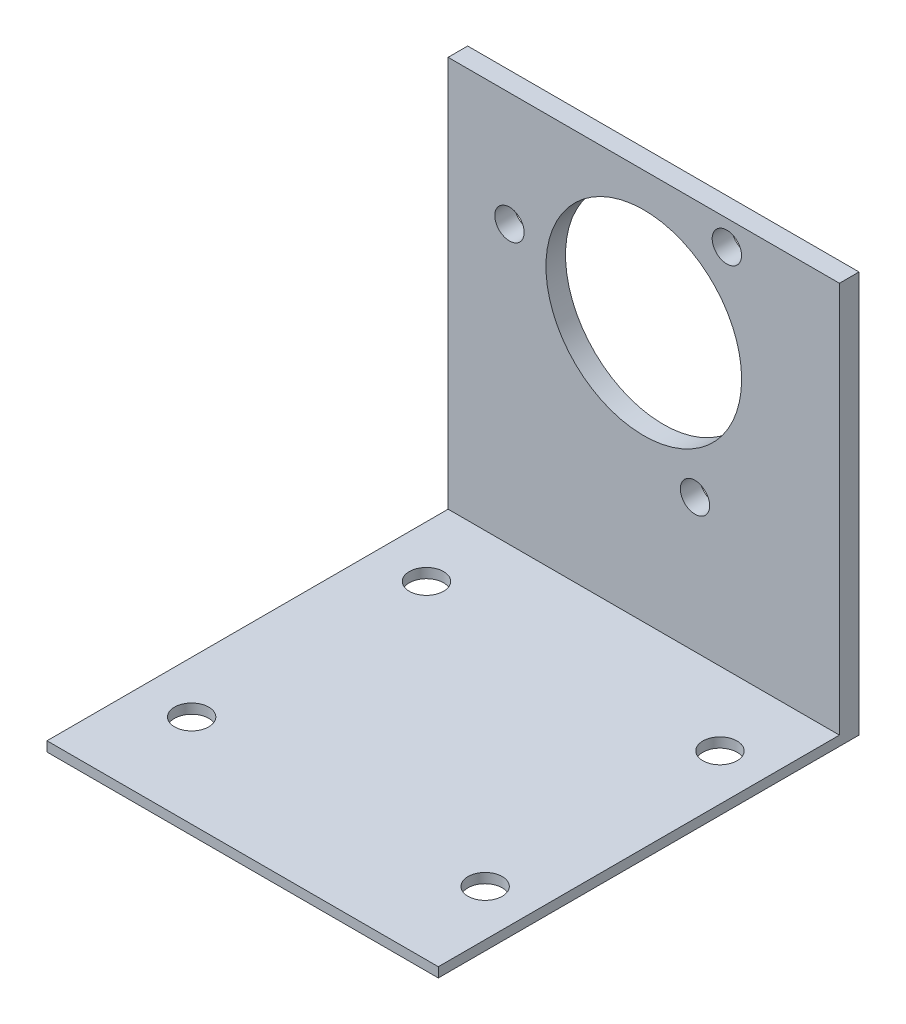
ISO-10303-21;
HEADER;
FILE_DESCRIPTION(('STEP AP214'),'2;1');
FILE_NAME('part.step','',(''),(''),'','','');
FILE_SCHEMA(('AUTOMOTIVE_DESIGN { 1 0 10303 214 1 1 1 1 }'));
ENDSEC;
DATA;
#1=APPLICATION_CONTEXT('core data for automotive mechanical design processes');
#2=APPLICATION_PROTOCOL_DEFINITION('international standard','automotive_design',2000,#1);
#3=PRODUCT_CONTEXT('',#1,'mechanical');
#4=PRODUCT('Part','Part','',(#3));
#5=PRODUCT_RELATED_PRODUCT_CATEGORY('part','',(#4));
#6=PRODUCT_DEFINITION_FORMATION('','',#4);
#7=PRODUCT_DEFINITION_CONTEXT('part definition',#1,'design');
#8=PRODUCT_DEFINITION('design','',#6,#7);
#9=PRODUCT_DEFINITION_SHAPE('','',#8);
#10=(LENGTH_UNIT() NAMED_UNIT(*) SI_UNIT(.MILLI.,.METRE.));
#11=(NAMED_UNIT(*) PLANE_ANGLE_UNIT() SI_UNIT($,.RADIAN.));
#12=(NAMED_UNIT(*) SI_UNIT($,.STERADIAN.) SOLID_ANGLE_UNIT());
#13=UNCERTAINTY_MEASURE_WITH_UNIT(LENGTH_MEASURE(1.E-05),#10,'distance_accuracy_value','');
#14=(GEOMETRIC_REPRESENTATION_CONTEXT(3) GLOBAL_UNCERTAINTY_ASSIGNED_CONTEXT((#13)) GLOBAL_UNIT_ASSIGNED_CONTEXT((#10,
#11,#12)) REPRESENTATION_CONTEXT('',''));
#15=CARTESIAN_POINT('',(0.,0.,0.));
#16=DIRECTION('',(0.,0.,1.));
#17=DIRECTION('',(1.,0.,0.));
#18=AXIS2_PLACEMENT_3D('',#15,#16,#17);
#19=CARTESIAN_POINT('',(0.,-1.,21.5));
#20=DIRECTION('',(0.,0.,1.));
#21=DIRECTION('',(1.,0.,0.));
#22=AXIS2_PLACEMENT_3D('',#19,#20,#21);
#23=PLANE('',#22);
#24=DIRECTION('',(1.,0.,0.));
#25=VECTOR('',#24,1.);
#26=CARTESIAN_POINT('',(0.,0.,21.5));
#27=LINE('',#26,#25);
#28=CARTESIAN_POINT('',(-20.,0.,21.5));
#29=VERTEX_POINT('',#28);
#30=CARTESIAN_POINT('',(20.,0.,21.5));
#31=VERTEX_POINT('',#30);
#32=EDGE_CURVE('E168',#29,#31,#27,.T.);
#33=ORIENTED_EDGE('',*,*,#32,.F.);
#34=DIRECTION('',(0.,1.,0.));
#35=VECTOR('',#34,1.);
#36=CARTESIAN_POINT('',(-20.,-1.,21.5));
#37=LINE('',#36,#35);
#38=CARTESIAN_POINT('',(-20.,-1.,21.5));
#39=VERTEX_POINT('',#38);
#40=EDGE_CURVE('E12',#39,#29,#37,.T.);
#41=ORIENTED_EDGE('',*,*,#40,.F.);
#42=DIRECTION('',(1.,0.,0.));
#43=VECTOR('',#42,1.);
#44=CARTESIAN_POINT('',(0.,-1.,21.5));
#45=LINE('',#44,#43);
#46=CARTESIAN_POINT('',(20.,-1.,21.5));
#47=VERTEX_POINT('',#46);
#48=EDGE_CURVE('E151',#39,#47,#45,.T.);
#49=ORIENTED_EDGE('',*,*,#48,.T.);
#50=DIRECTION('',(0.,1.,0.));
#51=VECTOR('',#50,1.);
#52=CARTESIAN_POINT('',(20.,-1.,21.5));
#53=LINE('',#52,#51);
#54=EDGE_CURVE('E53',#47,#31,#53,.T.);
#55=ORIENTED_EDGE('',*,*,#54,.T.);
#56=EDGE_LOOP('',(#33,#41,#49,#55));
#57=FACE_BOUND('',#56,.T.);
#58=ADVANCED_FACE('F49',(#57),#23,.T.);
#59=CARTESIAN_POINT('',(-20.,-1.,0.));
#60=DIRECTION('',(1.,0.,0.));
#61=DIRECTION('',(0.,0.,-1.));
#62=AXIS2_PLACEMENT_3D('',#59,#60,#61);
#63=PLANE('',#62);
#64=DIRECTION('',(0.,0.,-1.));
#65=VECTOR('',#64,1.);
#66=CARTESIAN_POINT('',(-20.,0.,0.));
#67=LINE('',#66,#65);
#68=CARTESIAN_POINT('',(-20.,0.,-19.5));
#69=VERTEX_POINT('',#68);
#70=EDGE_CURVE('E130',#29,#69,#67,.T.);
#71=ORIENTED_EDGE('',*,*,#70,.T.);
#72=DIRECTION('',(0.,-1.,0.));
#73=VECTOR('',#72,1.);
#74=CARTESIAN_POINT('',(-20.,40.,-19.5));
#75=LINE('',#74,#73);
#76=CARTESIAN_POINT('',(-20.,40.,-19.5));
#77=VERTEX_POINT('',#76);
#78=EDGE_CURVE('E113',#77,#69,#75,.T.);
#79=ORIENTED_EDGE('',*,*,#78,.F.);
#80=DIRECTION('',(0.,0.,1.));
#81=VECTOR('',#80,1.);
#82=CARTESIAN_POINT('',(-20.,40.,0.));
#83=LINE('',#82,#81);
#84=CARTESIAN_POINT('',(-20.,40.,-21.5));
#85=VERTEX_POINT('',#84);
#86=EDGE_CURVE('E120',#85,#77,#83,.T.);
#87=ORIENTED_EDGE('',*,*,#86,.F.);
#88=DIRECTION('',(0.,1.,0.));
#89=VECTOR('',#88,1.);
#90=CARTESIAN_POINT('',(-20.,-1.,-21.5));
#91=LINE('',#90,#89);
#92=CARTESIAN_POINT('',(-20.,-1.,-21.5));
#93=VERTEX_POINT('',#92);
#94=EDGE_CURVE('E58',#93,#85,#91,.T.);
#95=ORIENTED_EDGE('',*,*,#94,.F.);
#96=DIRECTION('',(0.,0.,-1.));
#97=VECTOR('',#96,1.);
#98=CARTESIAN_POINT('',(-20.,-1.,0.));
#99=LINE('',#98,#97);
#100=EDGE_CURVE('E157',#39,#93,#99,.T.);
#101=ORIENTED_EDGE('',*,*,#100,.F.);
#102=ORIENTED_EDGE('',*,*,#40,.T.);
#103=EDGE_LOOP('',(#71,#79,#87,#95,#101,#102));
#104=FACE_BOUND('',#103,.T.);
#105=ADVANCED_FACE('F129',(#104),#63,.F.);
#106=CARTESIAN_POINT('',(0.,-1.,-21.5));
#107=DIRECTION('',(0.,0.,1.));
#108=DIRECTION('',(1.,0.,0.));
#109=AXIS2_PLACEMENT_3D('',#106,#107,#108);
#110=PLANE('',#109);
#111=CARTESIAN_POINT('',(5.23636965743753,13.671109447397,-21.5));
#112=DIRECTION('',(0.,0.,1.));
#113=DIRECTION('',(1.,0.,0.));
#114=AXIS2_PLACEMENT_3D('',#111,#112,#113);
#115=CIRCLE('',#114,1.5);
#116=CARTESIAN_POINT('',(6.73636965743753,13.671109447397,-21.5));
#117=VERTEX_POINT('',#116);
#118=EDGE_CURVE('E253',#117,#117,#115,.T.);
#119=ORIENTED_EDGE('',*,*,#118,.T.);
#120=EDGE_LOOP('',(#119));
#121=FACE_BOUND('',#120,.T.);
#122=CARTESIAN_POINT('',(8.49196029220565,37.4492744232484,-21.5));
#123=DIRECTION('',(0.,0.,1.));
#124=DIRECTION('',(1.,0.,0.));
#125=AXIS2_PLACEMENT_3D('',#122,#123,#124);
#126=CIRCLE('',#125,1.5);
#127=CARTESIAN_POINT('',(9.99196029220565,37.4492744232484,-21.5));
#128=VERTEX_POINT('',#127);
#129=EDGE_CURVE('E249',#128,#128,#126,.T.);
#130=ORIENTED_EDGE('',*,*,#129,.T.);
#131=EDGE_LOOP('',(#130));
#132=FACE_BOUND('',#131,.T.);
#133=CARTESIAN_POINT('',(-13.7283299496432,28.3796161293546,-21.5));
#134=DIRECTION('',(0.,0.,1.));
#135=DIRECTION('',(1.,0.,0.));
#136=AXIS2_PLACEMENT_3D('',#133,#134,#135);
#137=CIRCLE('',#136,1.5);
#138=CARTESIAN_POINT('',(-12.2283299496432,28.3796161293546,-21.5));
#139=VERTEX_POINT('',#138);
#140=EDGE_CURVE('E247',#139,#139,#137,.T.);
#141=ORIENTED_EDGE('',*,*,#140,.T.);
#142=EDGE_LOOP('',(#141));
#143=FACE_BOUND('',#142,.T.);
#144=CARTESIAN_POINT('',(0.,26.5,-21.5));
#145=DIRECTION('',(0.,0.,1.));
#146=DIRECTION('',(1.,0.,0.));
#147=AXIS2_PLACEMENT_3D('',#144,#145,#146);
#148=CIRCLE('',#147,10.);
#149=CARTESIAN_POINT('',(10.,26.5,-21.5));
#150=VERTEX_POINT('',#149);
#151=EDGE_CURVE('E250',#150,#150,#148,.T.);
#152=ORIENTED_EDGE('',*,*,#151,.T.);
#153=EDGE_LOOP('',(#152));
#154=FACE_BOUND('',#153,.T.);
#155=ORIENTED_EDGE('',*,*,#94,.T.);
#156=DIRECTION('',(-1.,0.,0.));
#157=VECTOR('',#156,1.);
#158=CARTESIAN_POINT('',(0.,40.,-21.5));
#159=LINE('',#158,#157);
#160=CARTESIAN_POINT('',(20.,40.,-21.5));
#161=VERTEX_POINT('',#160);
#162=EDGE_CURVE('E126',#161,#85,#159,.T.);
#163=ORIENTED_EDGE('',*,*,#162,.F.);
#164=DIRECTION('',(0.,1.,0.));
#165=VECTOR('',#164,1.);
#166=CARTESIAN_POINT('',(20.,-1.,-21.5));
#167=LINE('',#166,#165);
#168=CARTESIAN_POINT('',(20.,-1.,-21.5));
#169=VERTEX_POINT('',#168);
#170=EDGE_CURVE('E174',#169,#161,#167,.T.);
#171=ORIENTED_EDGE('',*,*,#170,.F.);
#172=DIRECTION('',(1.,0.,0.));
#173=VECTOR('',#172,1.);
#174=CARTESIAN_POINT('',(0.,-1.,-21.5));
#175=LINE('',#174,#173);
#176=EDGE_CURVE('E155',#93,#169,#175,.T.);
#177=ORIENTED_EDGE('',*,*,#176,.F.);
#178=EDGE_LOOP('',(#155,#163,#171,#177));
#179=FACE_BOUND('',#178,.T.);
#180=ADVANCED_FACE('F194',(#121,#132,#143,#154,#179),#110,.F.);
#181=CARTESIAN_POINT('',(-14.7150530034863,-1.,-12.));
#182=DIRECTION('',(0.,1.,0.));
#183=DIRECTION('',(0.,0.,1.));
#184=AXIS2_PLACEMENT_3D('',#181,#182,#183);
#185=CYLINDRICAL_SURFACE('',#184,1.75);
#186=CARTESIAN_POINT('',(-14.7150530034863,-1.,-12.));
#187=DIRECTION('',(0.,1.,0.));
#188=DIRECTION('',(0.,0.,1.));
#189=AXIS2_PLACEMENT_3D('',#186,#187,#188);
#190=CIRCLE('',#189,1.75);
#191=CARTESIAN_POINT('',(-14.7150530034863,-1.,-10.25));
#192=VERTEX_POINT('',#191);
#193=EDGE_CURVE('E148',#192,#192,#190,.T.);
#194=ORIENTED_EDGE('',*,*,#193,.F.);
#195=EDGE_LOOP('',(#194));
#196=FACE_BOUND('',#195,.T.);
#197=CARTESIAN_POINT('',(-14.7150530034863,0.,-12.));
#198=DIRECTION('',(0.,1.,0.));
#199=DIRECTION('',(0.,0.,1.));
#200=AXIS2_PLACEMENT_3D('',#197,#198,#199);
#201=CIRCLE('',#200,1.75);
#202=CARTESIAN_POINT('',(-14.7150530034863,0.,-10.25));
#203=VERTEX_POINT('',#202);
#204=EDGE_CURVE('E165',#203,#203,#201,.T.);
#205=ORIENTED_EDGE('',*,*,#204,.T.);
#206=EDGE_LOOP('',(#205));
#207=FACE_BOUND('',#206,.T.);
#208=ADVANCED_FACE('F191',(#196,#207),#185,.F.);
#209=CARTESIAN_POINT('',(15.2849469965137,-1.,-12.));
#210=DIRECTION('',(0.,1.,0.));
#211=DIRECTION('',(0.,0.,1.));
#212=AXIS2_PLACEMENT_3D('',#209,#210,#211);
#213=CYLINDRICAL_SURFACE('',#212,1.75);
#214=CARTESIAN_POINT('',(15.2849469965137,-1.,-12.));
#215=DIRECTION('',(0.,1.,0.));
#216=DIRECTION('',(0.,0.,1.));
#217=AXIS2_PLACEMENT_3D('',#214,#215,#216);
#218=CIRCLE('',#217,1.75);
#219=CARTESIAN_POINT('',(15.2849469965137,-1.,-10.25));
#220=VERTEX_POINT('',#219);
#221=EDGE_CURVE('E145',#220,#220,#218,.T.);
#222=ORIENTED_EDGE('',*,*,#221,.F.);
#223=EDGE_LOOP('',(#222));
#224=FACE_BOUND('',#223,.T.);
#225=CARTESIAN_POINT('',(15.2849469965137,0.,-12.));
#226=DIRECTION('',(0.,1.,0.));
#227=DIRECTION('',(0.,0.,1.));
#228=AXIS2_PLACEMENT_3D('',#225,#226,#227);
#229=CIRCLE('',#228,1.75);
#230=CARTESIAN_POINT('',(15.2849469965137,0.,-10.25));
#231=VERTEX_POINT('',#230);
#232=EDGE_CURVE('E162',#231,#231,#229,.T.);
#233=ORIENTED_EDGE('',*,*,#232,.T.);
#234=EDGE_LOOP('',(#233));
#235=FACE_BOUND('',#234,.T.);
#236=ADVANCED_FACE('F193',(#224,#235),#213,.F.);
#237=CARTESIAN_POINT('',(-14.7150530034863,-1.,12.));
#238=DIRECTION('',(0.,1.,0.));
#239=DIRECTION('',(0.,0.,1.));
#240=AXIS2_PLACEMENT_3D('',#237,#238,#239);
#241=CYLINDRICAL_SURFACE('',#240,1.75);
#242=CARTESIAN_POINT('',(-14.7150530034863,-1.,12.));
#243=DIRECTION('',(0.,1.,0.));
#244=DIRECTION('',(0.,0.,1.));
#245=AXIS2_PLACEMENT_3D('',#242,#243,#244);
#246=CIRCLE('',#245,1.75);
#247=CARTESIAN_POINT('',(-14.7150530034863,-1.,13.75));
#248=VERTEX_POINT('',#247);
#249=EDGE_CURVE('E142',#248,#248,#246,.T.);
#250=ORIENTED_EDGE('',*,*,#249,.F.);
#251=EDGE_LOOP('',(#250));
#252=FACE_BOUND('',#251,.T.);
#253=CARTESIAN_POINT('',(-14.7150530034863,0.,12.));
#254=DIRECTION('',(0.,1.,0.));
#255=DIRECTION('',(0.,0.,1.));
#256=AXIS2_PLACEMENT_3D('',#253,#254,#255);
#257=CIRCLE('',#256,1.75);
#258=CARTESIAN_POINT('',(-14.7150530034863,0.,13.75));
#259=VERTEX_POINT('',#258);
#260=EDGE_CURVE('E134',#259,#259,#257,.T.);
#261=ORIENTED_EDGE('',*,*,#260,.T.);
#262=EDGE_LOOP('',(#261));
#263=FACE_BOUND('',#262,.T.);
#264=ADVANCED_FACE('F201',(#252,#263),#241,.F.);
#265=CARTESIAN_POINT('',(15.2849469965137,-1.,12.));
#266=DIRECTION('',(0.,1.,0.));
#267=DIRECTION('',(0.,0.,1.));
#268=AXIS2_PLACEMENT_3D('',#265,#266,#267);
#269=CYLINDRICAL_SURFACE('',#268,1.75);
#270=CARTESIAN_POINT('',(15.2849469965137,-1.,12.));
#271=DIRECTION('',(0.,1.,0.));
#272=DIRECTION('',(0.,0.,1.));
#273=AXIS2_PLACEMENT_3D('',#270,#271,#272);
#274=CIRCLE('',#273,1.75);
#275=CARTESIAN_POINT('',(15.2849469965137,-1.,13.75));
#276=VERTEX_POINT('',#275);
#277=EDGE_CURVE('E139',#276,#276,#274,.T.);
#278=ORIENTED_EDGE('',*,*,#277,.F.);
#279=EDGE_LOOP('',(#278));
#280=FACE_BOUND('',#279,.T.);
#281=CARTESIAN_POINT('',(15.2849469965137,0.,12.));
#282=DIRECTION('',(0.,1.,0.));
#283=DIRECTION('',(0.,0.,1.));
#284=AXIS2_PLACEMENT_3D('',#281,#282,#283);
#285=CIRCLE('',#284,1.75);
#286=CARTESIAN_POINT('',(15.2849469965137,0.,13.75));
#287=VERTEX_POINT('',#286);
#288=EDGE_CURVE('E131',#287,#287,#285,.T.);
#289=ORIENTED_EDGE('',*,*,#288,.T.);
#290=EDGE_LOOP('',(#289));
#291=FACE_BOUND('',#290,.T.);
#292=ADVANCED_FACE('F51',(#280,#291),#269,.F.);
#293=CARTESIAN_POINT('',(20.,-1.,0.));
#294=DIRECTION('',(1.,0.,0.));
#295=DIRECTION('',(0.,0.,-1.));
#296=AXIS2_PLACEMENT_3D('',#293,#294,#295);
#297=PLANE('',#296);
#298=DIRECTION('',(0.,0.,-1.));
#299=VECTOR('',#298,1.);
#300=CARTESIAN_POINT('',(20.,0.,0.));
#301=LINE('',#300,#299);
#302=CARTESIAN_POINT('',(20.,0.,-19.5));
#303=VERTEX_POINT('',#302);
#304=EDGE_CURVE('E171',#31,#303,#301,.T.);
#305=ORIENTED_EDGE('',*,*,#304,.F.);
#306=ORIENTED_EDGE('',*,*,#54,.F.);
#307=DIRECTION('',(0.,0.,-1.));
#308=VECTOR('',#307,1.);
#309=CARTESIAN_POINT('',(20.,-1.,0.));
#310=LINE('',#309,#308);
#311=EDGE_CURVE('E153',#47,#169,#310,.T.);
#312=ORIENTED_EDGE('',*,*,#311,.T.);
#313=ORIENTED_EDGE('',*,*,#170,.T.);
#314=DIRECTION('',(0.,0.,-1.));
#315=VECTOR('',#314,1.);
#316=CARTESIAN_POINT('',(20.,40.,0.));
#317=LINE('',#316,#315);
#318=CARTESIAN_POINT('',(20.,40.,-19.5));
#319=VERTEX_POINT('',#318);
#320=EDGE_CURVE('E119',#319,#161,#317,.T.);
#321=ORIENTED_EDGE('',*,*,#320,.F.);
#322=DIRECTION('',(0.,-1.,0.));
#323=VECTOR('',#322,1.);
#324=CARTESIAN_POINT('',(20.,40.,-19.5));
#325=LINE('',#324,#323);
#326=EDGE_CURVE('E115',#319,#303,#325,.T.);
#327=ORIENTED_EDGE('',*,*,#326,.T.);
#328=EDGE_LOOP('',(#305,#306,#312,#313,#321,#327));
#329=FACE_BOUND('',#328,.T.);
#330=ADVANCED_FACE('F177',(#329),#297,.T.);
#331=CARTESIAN_POINT('',(0.,-1.,0.));
#332=DIRECTION('',(0.,1.,0.));
#333=DIRECTION('',(0.,0.,1.));
#334=AXIS2_PLACEMENT_3D('',#331,#332,#333);
#335=PLANE('',#334);
#336=ORIENTED_EDGE('',*,*,#277,.T.);
#337=EDGE_LOOP('',(#336));
#338=FACE_BOUND('',#337,.T.);
#339=ORIENTED_EDGE('',*,*,#249,.T.);
#340=EDGE_LOOP('',(#339));
#341=FACE_BOUND('',#340,.T.);
#342=ORIENTED_EDGE('',*,*,#221,.T.);
#343=EDGE_LOOP('',(#342));
#344=FACE_BOUND('',#343,.T.);
#345=ORIENTED_EDGE('',*,*,#193,.T.);
#346=EDGE_LOOP('',(#345));
#347=FACE_BOUND('',#346,.T.);
#348=ORIENTED_EDGE('',*,*,#48,.F.);
#349=ORIENTED_EDGE('',*,*,#100,.T.);
#350=ORIENTED_EDGE('',*,*,#176,.T.);
#351=ORIENTED_EDGE('',*,*,#311,.F.);
#352=EDGE_LOOP('',(#348,#349,#350,#351));
#353=FACE_BOUND('',#352,.T.);
#354=ADVANCED_FACE('F181',(#338,#341,#344,#347,#353),#335,.F.);
#355=CARTESIAN_POINT('',(0.,0.,0.));
#356=DIRECTION('',(0.,1.,0.));
#357=DIRECTION('',(0.,0.,1.));
#358=AXIS2_PLACEMENT_3D('',#355,#356,#357);
#359=PLANE('',#358);
#360=DIRECTION('',(1.,0.,0.));
#361=VECTOR('',#360,1.);
#362=CARTESIAN_POINT('',(0.,0.,-19.5));
#363=LINE('',#362,#361);
#364=EDGE_CURVE('E66',#69,#303,#363,.T.);
#365=ORIENTED_EDGE('',*,*,#364,.F.);
#366=ORIENTED_EDGE('',*,*,#70,.F.);
#367=ORIENTED_EDGE('',*,*,#32,.T.);
#368=ORIENTED_EDGE('',*,*,#304,.T.);
#369=EDGE_LOOP('',(#365,#366,#367,#368));
#370=FACE_BOUND('',#369,.T.);
#371=ORIENTED_EDGE('',*,*,#288,.F.);
#372=EDGE_LOOP('',(#371));
#373=FACE_BOUND('',#372,.T.);
#374=ORIENTED_EDGE('',*,*,#260,.F.);
#375=EDGE_LOOP('',(#374));
#376=FACE_BOUND('',#375,.T.);
#377=ORIENTED_EDGE('',*,*,#232,.F.);
#378=EDGE_LOOP('',(#377));
#379=FACE_BOUND('',#378,.T.);
#380=ORIENTED_EDGE('',*,*,#204,.F.);
#381=EDGE_LOOP('',(#380));
#382=FACE_BOUND('',#381,.T.);
#383=ADVANCED_FACE('F178',(#370,#373,#376,#379,#382),#359,.T.);
#384=CARTESIAN_POINT('',(0.,40.,-19.5));
#385=DIRECTION('',(0.,0.,-1.));
#386=DIRECTION('',(-1.,0.,0.));
#387=AXIS2_PLACEMENT_3D('',#384,#385,#386);
#388=PLANE('',#387);
#389=CARTESIAN_POINT('',(5.23636965743753,13.671109447397,-19.5));
#390=DIRECTION('',(0.,0.,1.));
#391=DIRECTION('',(1.,0.,0.));
#392=AXIS2_PLACEMENT_3D('',#389,#390,#391);
#393=CIRCLE('',#392,1.5);
#394=CARTESIAN_POINT('',(6.73636965743753,13.671109447397,-19.5));
#395=VERTEX_POINT('',#394);
#396=EDGE_CURVE('E275',#395,#395,#393,.T.);
#397=ORIENTED_EDGE('',*,*,#396,.F.);
#398=EDGE_LOOP('',(#397));
#399=FACE_BOUND('',#398,.T.);
#400=CARTESIAN_POINT('',(8.49196029220565,37.4492744232484,-19.5));
#401=DIRECTION('',(0.,0.,1.));
#402=DIRECTION('',(1.,0.,0.));
#403=AXIS2_PLACEMENT_3D('',#400,#401,#402);
#404=CIRCLE('',#403,1.5);
#405=CARTESIAN_POINT('',(9.99196029220565,37.4492744232484,-19.5));
#406=VERTEX_POINT('',#405);
#407=EDGE_CURVE('E278',#406,#406,#404,.T.);
#408=ORIENTED_EDGE('',*,*,#407,.F.);
#409=EDGE_LOOP('',(#408));
#410=FACE_BOUND('',#409,.T.);
#411=CARTESIAN_POINT('',(-13.7283299496432,28.3796161293546,-19.5));
#412=DIRECTION('',(0.,0.,1.));
#413=DIRECTION('',(1.,0.,0.));
#414=AXIS2_PLACEMENT_3D('',#411,#412,#413);
#415=CIRCLE('',#414,1.5);
#416=CARTESIAN_POINT('',(-12.2283299496432,28.3796161293546,-19.5));
#417=VERTEX_POINT('',#416);
#418=EDGE_CURVE('E244',#417,#417,#415,.T.);
#419=ORIENTED_EDGE('',*,*,#418,.F.);
#420=EDGE_LOOP('',(#419));
#421=FACE_BOUND('',#420,.T.);
#422=CARTESIAN_POINT('',(0.,26.5,-19.5));
#423=DIRECTION('',(0.,0.,1.));
#424=DIRECTION('',(1.,0.,0.));
#425=AXIS2_PLACEMENT_3D('',#422,#423,#424);
#426=CIRCLE('',#425,10.);
#427=CARTESIAN_POINT('',(10.,26.5,-19.5));
#428=VERTEX_POINT('',#427);
#429=EDGE_CURVE('E256',#428,#428,#426,.T.);
#430=ORIENTED_EDGE('',*,*,#429,.F.);
#431=EDGE_LOOP('',(#430));
#432=FACE_BOUND('',#431,.T.);
#433=ORIENTED_EDGE('',*,*,#364,.T.);
#434=ORIENTED_EDGE('',*,*,#326,.F.);
#435=DIRECTION('',(1.,0.,0.));
#436=VECTOR('',#435,1.);
#437=CARTESIAN_POINT('',(0.,40.,-19.5));
#438=LINE('',#437,#436);
#439=EDGE_CURVE('E109',#77,#319,#438,.T.);
#440=ORIENTED_EDGE('',*,*,#439,.F.);
#441=ORIENTED_EDGE('',*,*,#78,.T.);
#442=EDGE_LOOP('',(#433,#434,#440,#441));
#443=FACE_BOUND('',#442,.T.);
#444=ADVANCED_FACE('F111',(#399,#410,#421,#432,#443),#388,.F.);
#445=CARTESIAN_POINT('',(0.,40.,0.));
#446=DIRECTION('',(0.,1.,0.));
#447=DIRECTION('',(0.,0.,1.));
#448=AXIS2_PLACEMENT_3D('',#445,#446,#447);
#449=PLANE('',#448);
#450=ORIENTED_EDGE('',*,*,#86,.T.);
#451=ORIENTED_EDGE('',*,*,#439,.T.);
#452=ORIENTED_EDGE('',*,*,#320,.T.);
#453=ORIENTED_EDGE('',*,*,#162,.T.);
#454=EDGE_LOOP('',(#450,#451,#452,#453));
#455=FACE_BOUND('',#454,.T.);
#456=ADVANCED_FACE('F124',(#455),#449,.T.);
#457=CARTESIAN_POINT('',(0.,26.5,-43.5));
#458=DIRECTION('',(0.,0.,1.));
#459=DIRECTION('',(1.,0.,0.));
#460=AXIS2_PLACEMENT_3D('',#457,#458,#459);
#461=CYLINDRICAL_SURFACE('',#460,10.);
#462=ORIENTED_EDGE('',*,*,#429,.T.);
#463=EDGE_LOOP('',(#462));
#464=FACE_BOUND('',#463,.T.);
#465=ORIENTED_EDGE('',*,*,#151,.F.);
#466=EDGE_LOOP('',(#465));
#467=FACE_BOUND('',#466,.T.);
#468=ADVANCED_FACE('F224',(#464,#467),#461,.F.);
#469=CARTESIAN_POINT('',(-13.7283299496432,28.3796161293546,-43.5));
#470=DIRECTION('',(0.,0.,1.));
#471=DIRECTION('',(1.,0.,0.));
#472=AXIS2_PLACEMENT_3D('',#469,#470,#471);
#473=CYLINDRICAL_SURFACE('',#472,1.5);
#474=ORIENTED_EDGE('',*,*,#418,.T.);
#475=EDGE_LOOP('',(#474));
#476=FACE_BOUND('',#475,.T.);
#477=ORIENTED_EDGE('',*,*,#140,.F.);
#478=EDGE_LOOP('',(#477));
#479=FACE_BOUND('',#478,.T.);
#480=ADVANCED_FACE('F227',(#476,#479),#473,.F.);
#481=CARTESIAN_POINT('',(8.49196029220565,37.4492744232484,-43.5));
#482=DIRECTION('',(0.,0.,1.));
#483=DIRECTION('',(1.,0.,0.));
#484=AXIS2_PLACEMENT_3D('',#481,#482,#483);
#485=CYLINDRICAL_SURFACE('',#484,1.5);
#486=ORIENTED_EDGE('',*,*,#407,.T.);
#487=EDGE_LOOP('',(#486));
#488=FACE_BOUND('',#487,.T.);
#489=ORIENTED_EDGE('',*,*,#129,.F.);
#490=EDGE_LOOP('',(#489));
#491=FACE_BOUND('',#490,.T.);
#492=ADVANCED_FACE('F232',(#488,#491),#485,.F.);
#493=CARTESIAN_POINT('',(5.23636965743753,13.671109447397,-43.5));
#494=DIRECTION('',(0.,0.,1.));
#495=DIRECTION('',(1.,0.,0.));
#496=AXIS2_PLACEMENT_3D('',#493,#494,#495);
#497=CYLINDRICAL_SURFACE('',#496,1.5);
#498=ORIENTED_EDGE('',*,*,#396,.T.);
#499=EDGE_LOOP('',(#498));
#500=FACE_BOUND('',#499,.T.);
#501=ORIENTED_EDGE('',*,*,#118,.F.);
#502=EDGE_LOOP('',(#501));
#503=FACE_BOUND('',#502,.T.);
#504=ADVANCED_FACE('F229',(#500,#503),#497,.F.);
#505=CLOSED_SHELL('',(#58,#105,#180,#208,#236,#264,#292,#330,#354,#383,#444,#456,#468,#480,#492,#504));
#506=MANIFOLD_SOLID_BREP('B2',#505);
#507=ADVANCED_BREP_SHAPE_REPRESENTATION('',(#18,#506),#14);
#508=SHAPE_DEFINITION_REPRESENTATION(#9,#507);
ENDSEC;
END-ISO-10303-21;
